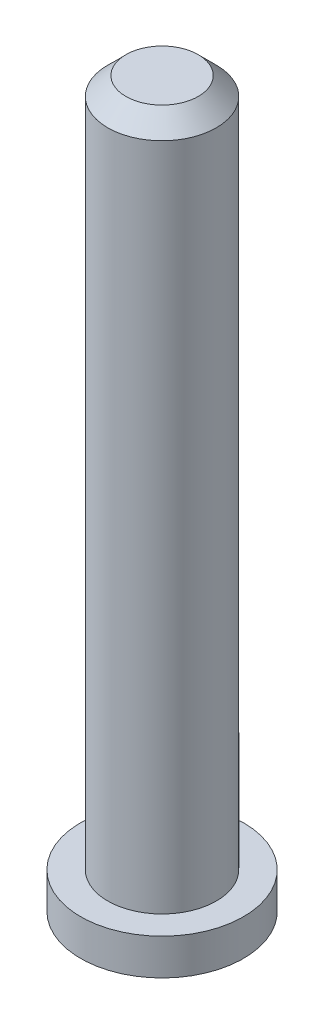
ISO-10303-21;
HEADER;
FILE_DESCRIPTION(('STEP AP214'),'2;1');
FILE_NAME('part.step','',(''),(''),'','','');
FILE_SCHEMA(('AUTOMOTIVE_DESIGN { 1 0 10303 214 1 1 1 1 }'));
ENDSEC;
DATA;
#1=APPLICATION_CONTEXT('core data for automotive mechanical design processes');
#2=APPLICATION_PROTOCOL_DEFINITION('international standard','automotive_design',2000,#1);
#3=PRODUCT_CONTEXT('',#1,'mechanical');
#4=PRODUCT('Part','Part','',(#3));
#5=PRODUCT_RELATED_PRODUCT_CATEGORY('part','',(#4));
#6=PRODUCT_DEFINITION_FORMATION('','',#4);
#7=PRODUCT_DEFINITION_CONTEXT('part definition',#1,'design');
#8=PRODUCT_DEFINITION('design','',#6,#7);
#9=PRODUCT_DEFINITION_SHAPE('','',#8);
#10=(LENGTH_UNIT() NAMED_UNIT(*) SI_UNIT(.MILLI.,.METRE.));
#11=(NAMED_UNIT(*) PLANE_ANGLE_UNIT() SI_UNIT($,.RADIAN.));
#12=(NAMED_UNIT(*) SI_UNIT($,.STERADIAN.) SOLID_ANGLE_UNIT());
#13=UNCERTAINTY_MEASURE_WITH_UNIT(LENGTH_MEASURE(1.E-05),#10,'distance_accuracy_value','');
#14=(GEOMETRIC_REPRESENTATION_CONTEXT(3) GLOBAL_UNCERTAINTY_ASSIGNED_CONTEXT((#13)) GLOBAL_UNIT_ASSIGNED_CONTEXT((#10,
#11,#12)) REPRESENTATION_CONTEXT('',''));
#15=CARTESIAN_POINT('',(0.,0.,0.));
#16=DIRECTION('',(0.,0.,1.));
#17=DIRECTION('',(1.,0.,0.));
#18=AXIS2_PLACEMENT_3D('',#15,#16,#17);
#19=CARTESIAN_POINT('',(0.,0.,0.));
#20=DIRECTION('',(0.,1.,0.));
#21=DIRECTION('',(0.,0.,1.));
#22=AXIS2_PLACEMENT_3D('',#19,#20,#21);
#23=PLANE('',#22);
#24=CARTESIAN_POINT('',(0.,0.,0.));
#25=DIRECTION('',(0.,-1.,0.));
#26=DIRECTION('',(0.,0.,-1.));
#27=AXIS2_PLACEMENT_3D('',#24,#25,#26);
#28=CIRCLE('',#27,2.25);
#29=CARTESIAN_POINT('',(0.,0.,-2.25));
#30=VERTEX_POINT('',#29);
#31=EDGE_CURVE('E49',#30,#30,#28,.T.);
#32=ORIENTED_EDGE('',*,*,#31,.T.);
#33=EDGE_LOOP('',(#32));
#34=FACE_BOUND('',#33,.T.);
#35=CARTESIAN_POINT('',(0.,0.,0.));
#36=DIRECTION('',(0.,1.,0.));
#37=DIRECTION('',(0.,0.,1.));
#38=AXIS2_PLACEMENT_3D('',#35,#36,#37);
#39=CIRCLE('',#38,0.3);
#40=CARTESIAN_POINT('',(0.,0.,0.3));
#41=VERTEX_POINT('',#40);
#42=EDGE_CURVE('E10',#41,#41,#39,.F.);
#43=ORIENTED_EDGE('',*,*,#42,.F.);
#44=EDGE_LOOP('',(#43));
#45=FACE_BOUND('',#44,.T.);
#46=ADVANCED_FACE('F26',(#34,#45),#23,.F.);
#47=CARTESIAN_POINT('',(0.,20.,0.));
#48=DIRECTION('',(0.,-1.,0.));
#49=DIRECTION('',(0.,0.,-1.));
#50=AXIS2_PLACEMENT_3D('',#47,#48,#49);
#51=CYLINDRICAL_SURFACE('',#50,1.5);
#52=CARTESIAN_POINT('',(0.,19.5,0.));
#53=DIRECTION('',(0.,1.,0.));
#54=DIRECTION('',(0.,0.,1.));
#55=AXIS2_PLACEMENT_3D('',#52,#53,#54);
#56=CIRCLE('',#55,1.5);
#57=CARTESIAN_POINT('',(0.,19.5,1.5));
#58=VERTEX_POINT('',#57);
#59=EDGE_CURVE('E37',#58,#58,#56,.F.);
#60=ORIENTED_EDGE('',*,*,#59,.T.);
#61=EDGE_LOOP('',(#60));
#62=FACE_BOUND('',#61,.T.);
#63=CARTESIAN_POINT('',(0.,1.,0.));
#64=DIRECTION('',(0.,-1.,0.));
#65=DIRECTION('',(0.,0.,-1.));
#66=AXIS2_PLACEMENT_3D('',#63,#64,#65);
#67=CIRCLE('',#66,1.5);
#68=CARTESIAN_POINT('',(0.,1.,-1.5));
#69=VERTEX_POINT('',#68);
#70=EDGE_CURVE('E33',#69,#69,#67,.T.);
#71=ORIENTED_EDGE('',*,*,#70,.F.);
#72=EDGE_LOOP('',(#71));
#73=FACE_BOUND('',#72,.T.);
#74=ADVANCED_FACE('F28',(#62,#73),#51,.T.);
#75=CARTESIAN_POINT('',(0.,20.,0.));
#76=DIRECTION('',(0.,1.,0.));
#77=DIRECTION('',(0.,0.,1.));
#78=AXIS2_PLACEMENT_3D('',#75,#76,#77);
#79=PLANE('',#78);
#80=CARTESIAN_POINT('',(0.,20.,0.));
#81=DIRECTION('',(0.,1.,0.));
#82=DIRECTION('',(0.,0.,1.));
#83=AXIS2_PLACEMENT_3D('',#80,#81,#82);
#84=CIRCLE('',#83,1.);
#85=CARTESIAN_POINT('',(0.,20.,1.));
#86=VERTEX_POINT('',#85);
#87=EDGE_CURVE('E41',#86,#86,#84,.T.);
#88=ORIENTED_EDGE('',*,*,#87,.T.);
#89=EDGE_LOOP('',(#88));
#90=FACE_BOUND('',#89,.T.);
#91=ADVANCED_FACE('F77',(#90),#79,.T.);
#92=CARTESIAN_POINT('',(0.,20.,0.));
#93=DIRECTION('',(0.,-1.,0.));
#94=DIRECTION('',(0.,0.,-1.));
#95=AXIS2_PLACEMENT_3D('',#92,#93,#94);
#96=CONICAL_SURFACE('',#95,1.,0.78539816339745);
#97=ORIENTED_EDGE('',*,*,#59,.F.);
#98=EDGE_LOOP('',(#97));
#99=FACE_BOUND('',#98,.T.);
#100=ORIENTED_EDGE('',*,*,#87,.F.);
#101=EDGE_LOOP('',(#100));
#102=FACE_BOUND('',#101,.T.);
#103=ADVANCED_FACE('F81',(#99,#102),#96,.T.);
#104=CARTESIAN_POINT('',(0.,1.,0.));
#105=DIRECTION('',(0.,-1.,0.));
#106=DIRECTION('',(0.,0.,-1.));
#107=AXIS2_PLACEMENT_3D('',#104,#105,#106);
#108=PLANE('',#107);
#109=CARTESIAN_POINT('',(0.,1.,0.));
#110=DIRECTION('',(0.,-1.,0.));
#111=DIRECTION('',(0.,0.,-1.));
#112=AXIS2_PLACEMENT_3D('',#109,#110,#111);
#113=CIRCLE('',#112,2.25);
#114=CARTESIAN_POINT('',(0.,1.,-2.25));
#115=VERTEX_POINT('',#114);
#116=EDGE_CURVE('E46',#115,#115,#113,.T.);
#117=ORIENTED_EDGE('',*,*,#116,.F.);
#118=EDGE_LOOP('',(#117));
#119=FACE_BOUND('',#118,.T.);
#120=ORIENTED_EDGE('',*,*,#70,.T.);
#121=EDGE_LOOP('',(#120));
#122=FACE_BOUND('',#121,.T.);
#123=ADVANCED_FACE('F68',(#119,#122),#108,.F.);
#124=CARTESIAN_POINT('',(0.,1.,0.));
#125=DIRECTION('',(0.,-1.,0.));
#126=DIRECTION('',(0.,0.,-1.));
#127=AXIS2_PLACEMENT_3D('',#124,#125,#126);
#128=CYLINDRICAL_SURFACE('',#127,2.25);
#129=ORIENTED_EDGE('',*,*,#116,.T.);
#130=EDGE_LOOP('',(#129));
#131=FACE_BOUND('',#130,.T.);
#132=ORIENTED_EDGE('',*,*,#31,.F.);
#133=EDGE_LOOP('',(#132));
#134=FACE_BOUND('',#133,.T.);
#135=ADVANCED_FACE('F60',(#131,#134),#128,.T.);
#136=CARTESIAN_POINT('',(0.,-0.55,0.));
#137=DIRECTION('',(0.,1.,0.));
#138=DIRECTION('',(0.,0.,1.));
#139=AXIS2_PLACEMENT_3D('',#136,#137,#138);
#140=CYLINDRICAL_SURFACE('',#139,0.3);
#141=CARTESIAN_POINT('',(0.,-0.55,0.));
#142=DIRECTION('',(0.,-1.,0.));
#143=DIRECTION('',(0.,0.,-1.));
#144=AXIS2_PLACEMENT_3D('',#141,#142,#143);
#145=CIRCLE('',#144,0.3);
#146=CARTESIAN_POINT('',(0.,-0.55,-0.3));
#147=VERTEX_POINT('',#146);
#148=EDGE_CURVE('E52',#147,#147,#145,.T.);
#149=ORIENTED_EDGE('',*,*,#148,.F.);
#150=EDGE_LOOP('',(#149));
#151=FACE_BOUND('',#150,.T.);
#152=ORIENTED_EDGE('',*,*,#42,.T.);
#153=EDGE_LOOP('',(#152));
#154=FACE_BOUND('',#153,.T.);
#155=ADVANCED_FACE('F58',(#151,#154),#140,.T.);
#156=CARTESIAN_POINT('',(0.,-0.55,0.));
#157=DIRECTION('',(0.,-1.,0.));
#158=DIRECTION('',(0.,0.,-1.));
#159=AXIS2_PLACEMENT_3D('',#156,#157,#158);
#160=PLANE('',#159);
#161=ORIENTED_EDGE('',*,*,#148,.T.);
#162=EDGE_LOOP('',(#161));
#163=FACE_BOUND('',#162,.T.);
#164=ADVANCED_FACE('F56',(#163),#160,.T.);
#165=CLOSED_SHELL('',(#46,#74,#91,#103,#123,#135,#155,#164));
#166=MANIFOLD_SOLID_BREP('B2',#165);
#167=ADVANCED_BREP_SHAPE_REPRESENTATION('',(#18,#166),#14);
#168=SHAPE_DEFINITION_REPRESENTATION(#9,#167);
ENDSEC;
END-ISO-10303-21;
